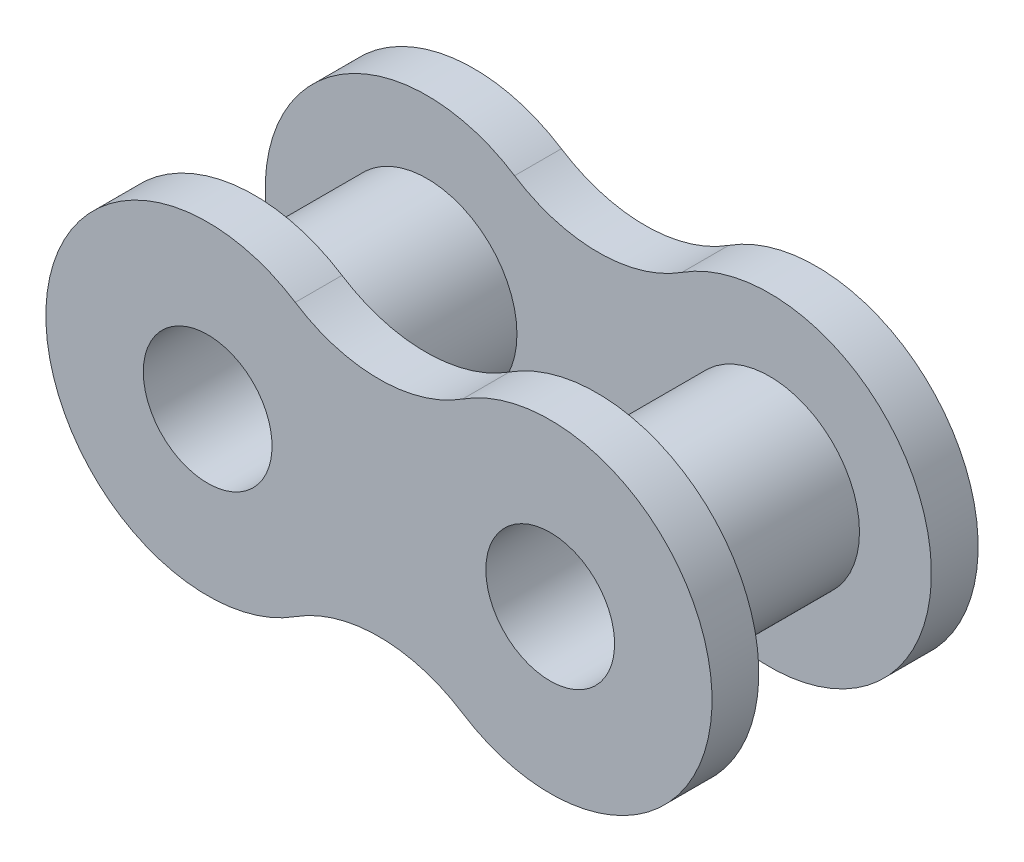
ISO-10303-21;
HEADER;
FILE_DESCRIPTION(('STEP AP214'),'2;1');
FILE_NAME('part.step','',(''),(''),'','','');
FILE_SCHEMA(('AUTOMOTIVE_DESIGN { 1 0 10303 214 1 1 1 1 }'));
ENDSEC;
DATA;
#1=APPLICATION_CONTEXT('core data for automotive mechanical design processes');
#2=APPLICATION_PROTOCOL_DEFINITION('international standard','automotive_design',2000,#1);
#3=PRODUCT_CONTEXT('',#1,'mechanical');
#4=PRODUCT('Part','Part','',(#3));
#5=PRODUCT_RELATED_PRODUCT_CATEGORY('part','',(#4));
#6=PRODUCT_DEFINITION_FORMATION('','',#4);
#7=PRODUCT_DEFINITION_CONTEXT('part definition',#1,'design');
#8=PRODUCT_DEFINITION('design','',#6,#7);
#9=PRODUCT_DEFINITION_SHAPE('','',#8);
#10=(LENGTH_UNIT() NAMED_UNIT(*) SI_UNIT(.MILLI.,.METRE.));
#11=(NAMED_UNIT(*) PLANE_ANGLE_UNIT() SI_UNIT($,.RADIAN.));
#12=(NAMED_UNIT(*) SI_UNIT($,.STERADIAN.) SOLID_ANGLE_UNIT());
#13=UNCERTAINTY_MEASURE_WITH_UNIT(LENGTH_MEASURE(1.E-05),#10,'distance_accuracy_value','');
#14=(GEOMETRIC_REPRESENTATION_CONTEXT(3) GLOBAL_UNCERTAINTY_ASSIGNED_CONTEXT((#13)) GLOBAL_UNIT_ASSIGNED_CONTEXT((#10,
#11,#12)) REPRESENTATION_CONTEXT('',''));
#15=CARTESIAN_POINT('',(0.,0.,0.));
#16=DIRECTION('',(0.,0.,1.));
#17=DIRECTION('',(1.,0.,0.));
#18=AXIS2_PLACEMENT_3D('',#15,#16,#17);
#19=CARTESIAN_POINT('',(-4.7625,0.,6.3));
#20=DIRECTION('',(0.,0.,-1.));
#21=DIRECTION('',(-1.,0.,0.));
#22=AXIS2_PLACEMENT_3D('',#19,#20,#21);
#23=CYLINDRICAL_SURFACE('',#22,2.5);
#24=CARTESIAN_POINT('',(-4.7625,0.,1.3));
#25=DIRECTION('',(0.,0.,-1.));
#26=DIRECTION('',(-1.,0.,0.));
#27=AXIS2_PLACEMENT_3D('',#24,#25,#26);
#28=CIRCLE('',#27,2.5);
#29=CARTESIAN_POINT('',(-7.2625,0.,1.3));
#30=VERTEX_POINT('',#29);
#31=EDGE_CURVE('E189',#30,#30,#28,.F.);
#32=ORIENTED_EDGE('',*,*,#31,.T.);
#33=EDGE_LOOP('',(#32));
#34=FACE_BOUND('',#33,.T.);
#35=CARTESIAN_POINT('',(-4.7625,0.,6.1));
#36=DIRECTION('',(0.,0.,1.));
#37=DIRECTION('',(1.,0.,0.));
#38=AXIS2_PLACEMENT_3D('',#35,#36,#37);
#39=CIRCLE('',#38,2.5);
#40=CARTESIAN_POINT('',(-2.2625,0.,6.1));
#41=VERTEX_POINT('',#40);
#42=EDGE_CURVE('E11',#41,#41,#39,.T.);
#43=ORIENTED_EDGE('',*,*,#42,.F.);
#44=EDGE_LOOP('',(#43));
#45=FACE_BOUND('',#44,.T.);
#46=ADVANCED_FACE('F45',(#34,#45),#23,.T.);
#47=CARTESIAN_POINT('',(4.7625,0.,6.3));
#48=DIRECTION('',(0.,0.,-1.));
#49=DIRECTION('',(-1.,0.,0.));
#50=AXIS2_PLACEMENT_3D('',#47,#48,#49);
#51=CYLINDRICAL_SURFACE('',#50,2.5);
#52=CARTESIAN_POINT('',(4.7625,0.,1.3));
#53=DIRECTION('',(0.,0.,-1.));
#54=DIRECTION('',(-1.,0.,0.));
#55=AXIS2_PLACEMENT_3D('',#52,#53,#54);
#56=CIRCLE('',#55,2.5);
#57=CARTESIAN_POINT('',(2.2625,0.,1.3));
#58=VERTEX_POINT('',#57);
#59=EDGE_CURVE('E49',#58,#58,#56,.F.);
#60=ORIENTED_EDGE('',*,*,#59,.T.);
#61=EDGE_LOOP('',(#60));
#62=FACE_BOUND('',#61,.T.);
#63=CARTESIAN_POINT('',(4.7625,0.,6.1));
#64=DIRECTION('',(0.,0.,1.));
#65=DIRECTION('',(1.,0.,0.));
#66=AXIS2_PLACEMENT_3D('',#63,#64,#65);
#67=CIRCLE('',#66,2.5);
#68=CARTESIAN_POINT('',(7.2625,0.,6.1));
#69=VERTEX_POINT('',#68);
#70=EDGE_CURVE('E55',#69,#69,#67,.T.);
#71=ORIENTED_EDGE('',*,*,#70,.F.);
#72=EDGE_LOOP('',(#71));
#73=FACE_BOUND('',#72,.T.);
#74=ADVANCED_FACE('F196',(#62,#73),#51,.T.);
#75=CARTESIAN_POINT('',(4.7625,0.,1.3));
#76=DIRECTION('',(0.,0.,-1.));
#77=DIRECTION('',(-1.,0.,0.));
#78=AXIS2_PLACEMENT_3D('',#75,#76,#77);
#79=CYLINDRICAL_SURFACE('',#78,4.5);
#80=CARTESIAN_POINT('',(4.7625,0.,0.));
#81=DIRECTION('',(0.,0.,1.));
#82=DIRECTION('',(-1.,0.,0.));
#83=AXIS2_PLACEMENT_3D('',#80,#81,#82);
#84=CIRCLE('',#83,4.5);
#85=CARTESIAN_POINT('',(2.32726966488064,-3.78413176500428,0.));
#86=VERTEX_POINT('',#85);
#87=CARTESIAN_POINT('',(2.32726966488063,3.78413176500428,0.));
#88=VERTEX_POINT('',#87);
#89=EDGE_CURVE('E134',#86,#88,#84,.T.);
#90=ORIENTED_EDGE('',*,*,#89,.T.);
#91=DIRECTION('',(0.,0.,-1.));
#92=VECTOR('',#91,1.);
#93=CARTESIAN_POINT('',(2.32726966488063,3.78413176500428,1.3));
#94=LINE('',#93,#92);
#95=CARTESIAN_POINT('',(2.32726966488063,3.78413176500428,1.3));
#96=VERTEX_POINT('',#95);
#97=EDGE_CURVE('E188',#96,#88,#94,.T.);
#98=ORIENTED_EDGE('',*,*,#97,.F.);
#99=CARTESIAN_POINT('',(4.7625,0.,1.3));
#100=DIRECTION('',(0.,0.,1.));
#101=DIRECTION('',(-1.,0.,0.));
#102=AXIS2_PLACEMENT_3D('',#99,#100,#101);
#103=CIRCLE('',#102,4.5);
#104=CARTESIAN_POINT('',(2.32726966488064,-3.78413176500428,1.3));
#105=VERTEX_POINT('',#104);
#106=EDGE_CURVE('E170',#105,#96,#103,.T.);
#107=ORIENTED_EDGE('',*,*,#106,.F.);
#108=DIRECTION('',(0.,0.,-1.));
#109=VECTOR('',#108,1.);
#110=CARTESIAN_POINT('',(2.32726966488064,-3.78413176500428,1.3));
#111=LINE('',#110,#109);
#112=EDGE_CURVE('E176',#105,#86,#111,.T.);
#113=ORIENTED_EDGE('',*,*,#112,.T.);
#114=EDGE_LOOP('',(#90,#98,#107,#113));
#115=FACE_BOUND('',#114,.T.);
#116=ADVANCED_FACE('F47',(#115),#79,.T.);
#117=CARTESIAN_POINT('',(0.,7.40050223214287,1.3));
#118=DIRECTION('',(0.,0.,-1.));
#119=DIRECTION('',(-1.,0.,0.));
#120=AXIS2_PLACEMENT_3D('',#117,#118,#119);
#121=CYLINDRICAL_SURFACE('',#120,4.30050223214287);
#122=CARTESIAN_POINT('',(0.,7.40050223214287,0.));
#123=DIRECTION('',(0.,0.,-1.));
#124=DIRECTION('',(1.,0.,0.));
#125=AXIS2_PLACEMENT_3D('',#122,#123,#124);
#126=CIRCLE('',#125,4.30050223214287);
#127=CARTESIAN_POINT('',(-2.32726966488064,3.78413176500428,0.));
#128=VERTEX_POINT('',#127);
#129=EDGE_CURVE('E179',#88,#128,#126,.T.);
#130=ORIENTED_EDGE('',*,*,#129,.T.);
#131=DIRECTION('',(0.,0.,-1.));
#132=VECTOR('',#131,1.);
#133=CARTESIAN_POINT('',(-2.32726966488064,3.78413176500428,1.3));
#134=LINE('',#133,#132);
#135=CARTESIAN_POINT('',(-2.32726966488064,3.78413176500428,1.3));
#136=VERTEX_POINT('',#135);
#137=EDGE_CURVE('E186',#136,#128,#134,.T.);
#138=ORIENTED_EDGE('',*,*,#137,.F.);
#139=CARTESIAN_POINT('',(0.,7.40050223214287,1.3));
#140=DIRECTION('',(0.,0.,-1.));
#141=DIRECTION('',(1.,0.,0.));
#142=AXIS2_PLACEMENT_3D('',#139,#140,#141);
#143=CIRCLE('',#142,4.30050223214287);
#144=EDGE_CURVE('E96',#96,#136,#143,.T.);
#145=ORIENTED_EDGE('',*,*,#144,.F.);
#146=ORIENTED_EDGE('',*,*,#97,.T.);
#147=EDGE_LOOP('',(#130,#138,#145,#146));
#148=FACE_BOUND('',#147,.T.);
#149=ADVANCED_FACE('F209',(#148),#121,.F.);
#150=CARTESIAN_POINT('',(-4.7625,0.,1.3));
#151=DIRECTION('',(0.,0.,-1.));
#152=DIRECTION('',(-1.,0.,0.));
#153=AXIS2_PLACEMENT_3D('',#150,#151,#152);
#154=CYLINDRICAL_SURFACE('',#153,4.5);
#155=CARTESIAN_POINT('',(-4.7625,0.,0.));
#156=DIRECTION('',(0.,0.,1.));
#157=DIRECTION('',(1.,0.,0.));
#158=AXIS2_PLACEMENT_3D('',#155,#156,#157);
#159=CIRCLE('',#158,4.5);
#160=CARTESIAN_POINT('',(-2.32726966488064,-3.78413176500428,0.));
#161=VERTEX_POINT('',#160);
#162=EDGE_CURVE('E82',#128,#161,#159,.T.);
#163=ORIENTED_EDGE('',*,*,#162,.T.);
#164=DIRECTION('',(0.,0.,-1.));
#165=VECTOR('',#164,1.);
#166=CARTESIAN_POINT('',(-2.32726966488064,-3.78413176500428,1.3));
#167=LINE('',#166,#165);
#168=CARTESIAN_POINT('',(-2.32726966488064,-3.78413176500428,1.3));
#169=VERTEX_POINT('',#168);
#170=EDGE_CURVE('E184',#169,#161,#167,.T.);
#171=ORIENTED_EDGE('',*,*,#170,.F.);
#172=CARTESIAN_POINT('',(-4.7625,0.,1.3));
#173=DIRECTION('',(0.,0.,1.));
#174=DIRECTION('',(1.,0.,0.));
#175=AXIS2_PLACEMENT_3D('',#172,#173,#174);
#176=CIRCLE('',#175,4.5);
#177=EDGE_CURVE('E173',#136,#169,#176,.T.);
#178=ORIENTED_EDGE('',*,*,#177,.F.);
#179=ORIENTED_EDGE('',*,*,#137,.T.);
#180=EDGE_LOOP('',(#163,#171,#178,#179));
#181=FACE_BOUND('',#180,.T.);
#182=ADVANCED_FACE('F212',(#181),#154,.T.);
#183=CARTESIAN_POINT('',(0.,-7.40050223214287,1.3));
#184=DIRECTION('',(0.,0.,-1.));
#185=DIRECTION('',(-1.,0.,0.));
#186=AXIS2_PLACEMENT_3D('',#183,#184,#185);
#187=CYLINDRICAL_SURFACE('',#186,4.30050223214287);
#188=CARTESIAN_POINT('',(0.,-7.40050223214287,0.));
#189=DIRECTION('',(0.,0.,-1.));
#190=DIRECTION('',(-1.,0.,0.));
#191=AXIS2_PLACEMENT_3D('',#188,#189,#190);
#192=CIRCLE('',#191,4.30050223214287);
#193=EDGE_CURVE('E88',#161,#86,#192,.T.);
#194=ORIENTED_EDGE('',*,*,#193,.T.);
#195=ORIENTED_EDGE('',*,*,#112,.F.);
#196=CARTESIAN_POINT('',(0.,-7.40050223214287,1.3));
#197=DIRECTION('',(0.,0.,-1.));
#198=DIRECTION('',(-1.,0.,0.));
#199=AXIS2_PLACEMENT_3D('',#196,#197,#198);
#200=CIRCLE('',#199,4.30050223214287);
#201=EDGE_CURVE('E64',#169,#105,#200,.T.);
#202=ORIENTED_EDGE('',*,*,#201,.F.);
#203=ORIENTED_EDGE('',*,*,#170,.T.);
#204=EDGE_LOOP('',(#194,#195,#202,#203));
#205=FACE_BOUND('',#204,.T.);
#206=ADVANCED_FACE('F203',(#205),#187,.F.);
#207=CARTESIAN_POINT('',(2.38125,-3.70025111607143,1.3));
#208=DIRECTION('',(0.,0.,-1.));
#209=DIRECTION('',(-1.,0.,0.));
#210=AXIS2_PLACEMENT_3D('',#207,#208,#209);
#211=PLANE('',#210);
#212=ORIENTED_EDGE('',*,*,#59,.F.);
#213=EDGE_LOOP('',(#212));
#214=FACE_BOUND('',#213,.T.);
#215=ORIENTED_EDGE('',*,*,#31,.F.);
#216=EDGE_LOOP('',(#215));
#217=FACE_BOUND('',#216,.T.);
#218=ORIENTED_EDGE('',*,*,#106,.T.);
#219=ORIENTED_EDGE('',*,*,#144,.T.);
#220=ORIENTED_EDGE('',*,*,#177,.T.);
#221=ORIENTED_EDGE('',*,*,#201,.T.);
#222=EDGE_LOOP('',(#218,#219,#220,#221));
#223=FACE_BOUND('',#222,.T.);
#224=ADVANCED_FACE('F199',(#214,#217,#223),#211,.F.);
#225=CARTESIAN_POINT('',(2.38125,-3.70025111607143,0.));
#226=DIRECTION('',(0.,0.,-1.));
#227=DIRECTION('',(-1.,0.,0.));
#228=AXIS2_PLACEMENT_3D('',#225,#226,#227);
#229=PLANE('',#228);
#230=CARTESIAN_POINT('',(4.7625,0.,0.));
#231=DIRECTION('',(0.,0.,-1.));
#232=DIRECTION('',(-1.,0.,0.));
#233=AXIS2_PLACEMENT_3D('',#230,#231,#232);
#234=CIRCLE('',#233,1.79);
#235=CARTESIAN_POINT('',(2.9725,0.,0.));
#236=VERTEX_POINT('',#235);
#237=EDGE_CURVE('E368',#236,#236,#234,.T.);
#238=ORIENTED_EDGE('',*,*,#237,.F.);
#239=EDGE_LOOP('',(#238));
#240=FACE_BOUND('',#239,.T.);
#241=CARTESIAN_POINT('',(-4.7625,0.,0.));
#242=DIRECTION('',(0.,0.,-1.));
#243=DIRECTION('',(-1.,0.,0.));
#244=AXIS2_PLACEMENT_3D('',#241,#242,#243);
#245=CIRCLE('',#244,1.79);
#246=CARTESIAN_POINT('',(-6.5525,0.,0.));
#247=VERTEX_POINT('',#246);
#248=EDGE_CURVE('E369',#247,#247,#245,.T.);
#249=ORIENTED_EDGE('',*,*,#248,.F.);
#250=EDGE_LOOP('',(#249));
#251=FACE_BOUND('',#250,.T.);
#252=ORIENTED_EDGE('',*,*,#89,.F.);
#253=ORIENTED_EDGE('',*,*,#193,.F.);
#254=ORIENTED_EDGE('',*,*,#162,.F.);
#255=ORIENTED_EDGE('',*,*,#129,.F.);
#256=EDGE_LOOP('',(#252,#253,#254,#255));
#257=FACE_BOUND('',#256,.T.);
#258=ADVANCED_FACE('F202',(#240,#251,#257),#229,.T.);
#259=CARTESIAN_POINT('',(2.38125,-3.70025111607143,7.4));
#260=DIRECTION('',(0.,0.,1.));
#261=DIRECTION('',(-1.,0.,0.));
#262=AXIS2_PLACEMENT_3D('',#259,#260,#261);
#263=PLANE('',#262);
#264=CARTESIAN_POINT('',(4.7625,0.,7.4));
#265=DIRECTION('',(0.,0.,-1.));
#266=DIRECTION('',(-1.,0.,0.));
#267=AXIS2_PLACEMENT_3D('',#264,#265,#266);
#268=CIRCLE('',#267,1.79);
#269=CARTESIAN_POINT('',(2.9725,0.,7.4));
#270=VERTEX_POINT('',#269);
#271=EDGE_CURVE('E157',#270,#270,#268,.T.);
#272=ORIENTED_EDGE('',*,*,#271,.T.);
#273=EDGE_LOOP('',(#272));
#274=FACE_BOUND('',#273,.T.);
#275=CARTESIAN_POINT('',(-4.7625,0.,7.4));
#276=DIRECTION('',(0.,0.,-1.));
#277=DIRECTION('',(-1.,0.,0.));
#278=AXIS2_PLACEMENT_3D('',#275,#276,#277);
#279=CIRCLE('',#278,1.79);
#280=CARTESIAN_POINT('',(-6.5525,0.,7.4));
#281=VERTEX_POINT('',#280);
#282=EDGE_CURVE('E373',#281,#281,#279,.T.);
#283=ORIENTED_EDGE('',*,*,#282,.T.);
#284=EDGE_LOOP('',(#283));
#285=FACE_BOUND('',#284,.T.);
#286=CARTESIAN_POINT('',(4.7625,0.,7.4));
#287=DIRECTION('',(0.,0.,1.));
#288=DIRECTION('',(-1.,0.,0.));
#289=AXIS2_PLACEMENT_3D('',#286,#287,#288);
#290=CIRCLE('',#289,4.5);
#291=CARTESIAN_POINT('',(2.32726966488064,-3.78413176500428,7.4));
#292=VERTEX_POINT('',#291);
#293=CARTESIAN_POINT('',(2.32726966488063,3.78413176500428,7.4));
#294=VERTEX_POINT('',#293);
#295=EDGE_CURVE('E129',#292,#294,#290,.T.);
#296=ORIENTED_EDGE('',*,*,#295,.T.);
#297=CARTESIAN_POINT('',(0.,7.40050223214287,7.4));
#298=DIRECTION('',(0.,0.,-1.));
#299=DIRECTION('',(1.,0.,0.));
#300=AXIS2_PLACEMENT_3D('',#297,#298,#299);
#301=CIRCLE('',#300,4.30050223214287);
#302=CARTESIAN_POINT('',(-2.32726966488064,3.78413176500428,7.4));
#303=VERTEX_POINT('',#302);
#304=EDGE_CURVE('E145',#294,#303,#301,.T.);
#305=ORIENTED_EDGE('',*,*,#304,.T.);
#306=CARTESIAN_POINT('',(-4.7625,0.,7.4));
#307=DIRECTION('',(0.,0.,1.));
#308=DIRECTION('',(1.,0.,0.));
#309=AXIS2_PLACEMENT_3D('',#306,#307,#308);
#310=CIRCLE('',#309,4.5);
#311=CARTESIAN_POINT('',(-2.32726966488064,-3.78413176500428,7.4));
#312=VERTEX_POINT('',#311);
#313=EDGE_CURVE('E159',#303,#312,#310,.T.);
#314=ORIENTED_EDGE('',*,*,#313,.T.);
#315=CARTESIAN_POINT('',(0.,-7.40050223214287,7.4));
#316=DIRECTION('',(0.,0.,-1.));
#317=DIRECTION('',(-1.,0.,0.));
#318=AXIS2_PLACEMENT_3D('',#315,#316,#317);
#319=CIRCLE('',#318,4.30050223214287);
#320=EDGE_CURVE('E156',#312,#292,#319,.T.);
#321=ORIENTED_EDGE('',*,*,#320,.T.);
#322=EDGE_LOOP('',(#296,#305,#314,#321));
#323=FACE_BOUND('',#322,.T.);
#324=ADVANCED_FACE('F214',(#274,#285,#323),#263,.T.);
#325=CARTESIAN_POINT('',(2.38125,-3.70025111607143,6.1));
#326=DIRECTION('',(0.,0.,1.));
#327=DIRECTION('',(-1.,0.,0.));
#328=AXIS2_PLACEMENT_3D('',#325,#326,#327);
#329=PLANE('',#328);
#330=ORIENTED_EDGE('',*,*,#42,.T.);
#331=EDGE_LOOP('',(#330));
#332=FACE_BOUND('',#331,.T.);
#333=ORIENTED_EDGE('',*,*,#70,.T.);
#334=EDGE_LOOP('',(#333));
#335=FACE_BOUND('',#334,.T.);
#336=CARTESIAN_POINT('',(4.7625,0.,6.1));
#337=DIRECTION('',(0.,0.,1.));
#338=DIRECTION('',(-1.,0.,0.));
#339=AXIS2_PLACEMENT_3D('',#336,#337,#338);
#340=CIRCLE('',#339,4.5);
#341=CARTESIAN_POINT('',(2.32726966488064,-3.78413176500428,6.1));
#342=VERTEX_POINT('',#341);
#343=CARTESIAN_POINT('',(2.32726966488063,3.78413176500428,6.1));
#344=VERTEX_POINT('',#343);
#345=EDGE_CURVE('E126',#342,#344,#340,.T.);
#346=ORIENTED_EDGE('',*,*,#345,.F.);
#347=CARTESIAN_POINT('',(0.,-7.40050223214287,6.1));
#348=DIRECTION('',(0.,0.,-1.));
#349=DIRECTION('',(-1.,0.,0.));
#350=AXIS2_PLACEMENT_3D('',#347,#348,#349);
#351=CIRCLE('',#350,4.30050223214287);
#352=CARTESIAN_POINT('',(-2.32726966488064,-3.78413176500428,6.1));
#353=VERTEX_POINT('',#352);
#354=EDGE_CURVE('E141',#353,#342,#351,.T.);
#355=ORIENTED_EDGE('',*,*,#354,.F.);
#356=CARTESIAN_POINT('',(-4.7625,0.,6.1));
#357=DIRECTION('',(0.,0.,1.));
#358=DIRECTION('',(1.,0.,0.));
#359=AXIS2_PLACEMENT_3D('',#356,#357,#358);
#360=CIRCLE('',#359,4.5);
#361=CARTESIAN_POINT('',(-2.32726966488064,3.78413176500428,6.1));
#362=VERTEX_POINT('',#361);
#363=EDGE_CURVE('E148',#362,#353,#360,.T.);
#364=ORIENTED_EDGE('',*,*,#363,.F.);
#365=CARTESIAN_POINT('',(0.,7.40050223214287,6.1));
#366=DIRECTION('',(0.,0.,-1.));
#367=DIRECTION('',(1.,0.,0.));
#368=AXIS2_PLACEMENT_3D('',#365,#366,#367);
#369=CIRCLE('',#368,4.30050223214287);
#370=EDGE_CURVE('E144',#344,#362,#369,.T.);
#371=ORIENTED_EDGE('',*,*,#370,.F.);
#372=EDGE_LOOP('',(#346,#355,#364,#371));
#373=FACE_BOUND('',#372,.T.);
#374=ADVANCED_FACE('F139',(#332,#335,#373),#329,.F.);
#375=CARTESIAN_POINT('',(0.,7.40050223214287,6.1));
#376=DIRECTION('',(0.,0.,1.));
#377=DIRECTION('',(1.,0.,0.));
#378=AXIS2_PLACEMENT_3D('',#375,#376,#377);
#379=CYLINDRICAL_SURFACE('',#378,4.30050223214287);
#380=ORIENTED_EDGE('',*,*,#304,.F.);
#381=DIRECTION('',(0.,0.,1.));
#382=VECTOR('',#381,1.);
#383=CARTESIAN_POINT('',(2.32726966488063,3.78413176500428,6.1));
#384=LINE('',#383,#382);
#385=EDGE_CURVE('E154',#344,#294,#384,.T.);
#386=ORIENTED_EDGE('',*,*,#385,.F.);
#387=ORIENTED_EDGE('',*,*,#370,.T.);
#388=DIRECTION('',(0.,0.,1.));
#389=VECTOR('',#388,1.);
#390=CARTESIAN_POINT('',(-2.32726966488064,3.78413176500428,6.1));
#391=LINE('',#390,#389);
#392=EDGE_CURVE('E165',#362,#303,#391,.T.);
#393=ORIENTED_EDGE('',*,*,#392,.T.);
#394=EDGE_LOOP('',(#380,#386,#387,#393));
#395=FACE_BOUND('',#394,.T.);
#396=ADVANCED_FACE('F248',(#395),#379,.F.);
#397=CARTESIAN_POINT('',(-4.7625,0.,6.1));
#398=DIRECTION('',(0.,0.,1.));
#399=DIRECTION('',(1.,0.,0.));
#400=AXIS2_PLACEMENT_3D('',#397,#398,#399);
#401=CYLINDRICAL_SURFACE('',#400,4.5);
#402=ORIENTED_EDGE('',*,*,#313,.F.);
#403=ORIENTED_EDGE('',*,*,#392,.F.);
#404=ORIENTED_EDGE('',*,*,#363,.T.);
#405=DIRECTION('',(0.,0.,1.));
#406=VECTOR('',#405,1.);
#407=CARTESIAN_POINT('',(-2.32726966488064,-3.78413176500428,6.1));
#408=LINE('',#407,#406);
#409=EDGE_CURVE('E135',#353,#312,#408,.T.);
#410=ORIENTED_EDGE('',*,*,#409,.T.);
#411=EDGE_LOOP('',(#402,#403,#404,#410));
#412=FACE_BOUND('',#411,.T.);
#413=ADVANCED_FACE('F245',(#412),#401,.T.);
#414=CARTESIAN_POINT('',(0.,-7.40050223214287,6.1));
#415=DIRECTION('',(0.,0.,1.));
#416=DIRECTION('',(1.,0.,0.));
#417=AXIS2_PLACEMENT_3D('',#414,#415,#416);
#418=CYLINDRICAL_SURFACE('',#417,4.30050223214287);
#419=ORIENTED_EDGE('',*,*,#320,.F.);
#420=ORIENTED_EDGE('',*,*,#409,.F.);
#421=ORIENTED_EDGE('',*,*,#354,.T.);
#422=DIRECTION('',(0.,0.,1.));
#423=VECTOR('',#422,1.);
#424=CARTESIAN_POINT('',(2.32726966488064,-3.78413176500428,6.1));
#425=LINE('',#424,#423);
#426=EDGE_CURVE('E123',#342,#292,#425,.T.);
#427=ORIENTED_EDGE('',*,*,#426,.T.);
#428=EDGE_LOOP('',(#419,#420,#421,#427));
#429=FACE_BOUND('',#428,.T.);
#430=ADVANCED_FACE('F147',(#429),#418,.F.);
#431=CARTESIAN_POINT('',(4.7625,0.,6.1));
#432=DIRECTION('',(0.,0.,1.));
#433=DIRECTION('',(1.,0.,0.));
#434=AXIS2_PLACEMENT_3D('',#431,#432,#433);
#435=CYLINDRICAL_SURFACE('',#434,4.5);
#436=ORIENTED_EDGE('',*,*,#295,.F.);
#437=ORIENTED_EDGE('',*,*,#426,.F.);
#438=ORIENTED_EDGE('',*,*,#345,.T.);
#439=ORIENTED_EDGE('',*,*,#385,.T.);
#440=EDGE_LOOP('',(#436,#437,#438,#439));
#441=FACE_BOUND('',#440,.T.);
#442=ADVANCED_FACE('F125',(#441),#435,.T.);
#443=CARTESIAN_POINT('',(4.7625,0.,6.3));
#444=DIRECTION('',(0.,0.,-1.));
#445=DIRECTION('',(-1.,0.,0.));
#446=AXIS2_PLACEMENT_3D('',#443,#444,#445);
#447=CYLINDRICAL_SURFACE('',#446,1.79);
#448=ORIENTED_EDGE('',*,*,#271,.F.);
#449=EDGE_LOOP('',(#448));
#450=FACE_BOUND('',#449,.T.);
#451=ORIENTED_EDGE('',*,*,#237,.T.);
#452=EDGE_LOOP('',(#451));
#453=FACE_BOUND('',#452,.T.);
#454=ADVANCED_FACE('F237',(#450,#453),#447,.F.);
#455=CARTESIAN_POINT('',(-4.7625,0.,6.3));
#456=DIRECTION('',(0.,0.,-1.));
#457=DIRECTION('',(-1.,0.,0.));
#458=AXIS2_PLACEMENT_3D('',#455,#456,#457);
#459=CYLINDRICAL_SURFACE('',#458,1.79);
#460=ORIENTED_EDGE('',*,*,#282,.F.);
#461=EDGE_LOOP('',(#460));
#462=FACE_BOUND('',#461,.T.);
#463=ORIENTED_EDGE('',*,*,#248,.T.);
#464=EDGE_LOOP('',(#463));
#465=FACE_BOUND('',#464,.T.);
#466=ADVANCED_FACE('F234',(#462,#465),#459,.F.);
#467=CLOSED_SHELL('',(#46,#74,#116,#149,#182,#206,#224,#258,#324,#374,#396,#413,#430,#442,#454,#466));
#468=MANIFOLD_SOLID_BREP('B2',#467);
#469=ADVANCED_BREP_SHAPE_REPRESENTATION('',(#18,#468),#14);
#470=SHAPE_DEFINITION_REPRESENTATION(#9,#469);
ENDSEC;
END-ISO-10303-21;
